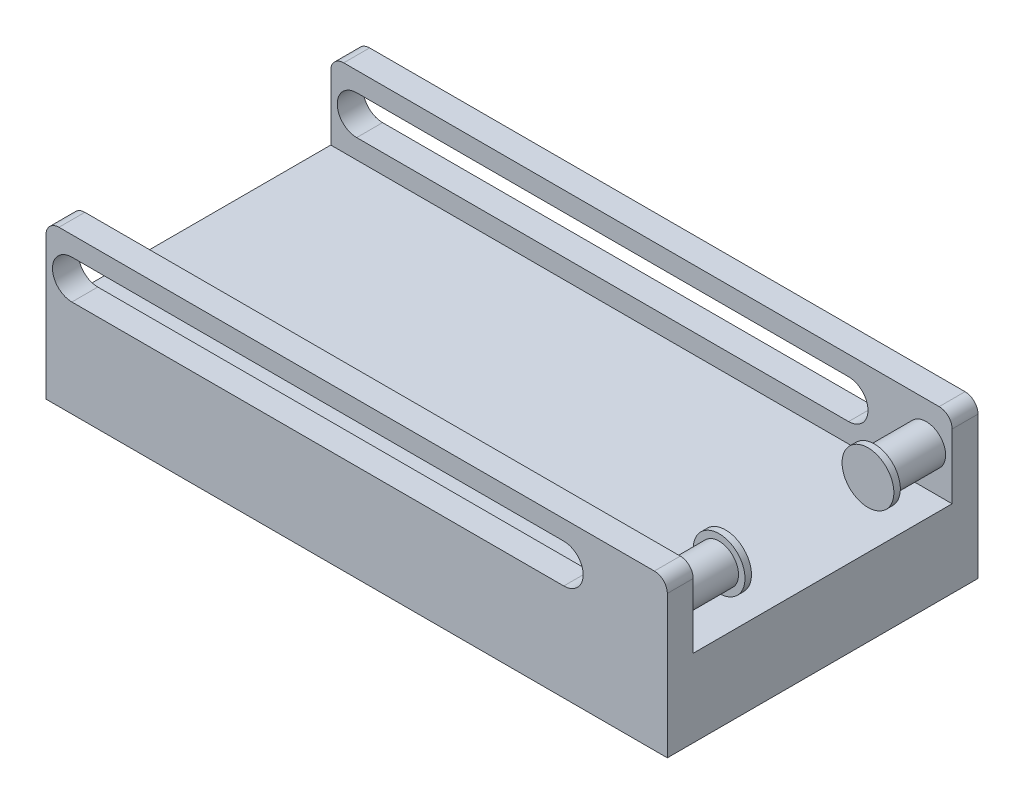
ISO-10303-21;
HEADER;
FILE_DESCRIPTION(('STEP AP214'),'2;1');
FILE_NAME('part.step','',(''),(''),'','','');
FILE_SCHEMA(('AUTOMOTIVE_DESIGN { 1 0 10303 214 1 1 1 1 }'));
ENDSEC;
DATA;
#1=APPLICATION_CONTEXT('core data for automotive mechanical design processes');
#2=APPLICATION_PROTOCOL_DEFINITION('international standard','automotive_design',2000,#1);
#3=PRODUCT_CONTEXT('',#1,'mechanical');
#4=PRODUCT('Part','Part','',(#3));
#5=PRODUCT_RELATED_PRODUCT_CATEGORY('part','',(#4));
#6=PRODUCT_DEFINITION_FORMATION('','',#4);
#7=PRODUCT_DEFINITION_CONTEXT('part definition',#1,'design');
#8=PRODUCT_DEFINITION('design','',#6,#7);
#9=PRODUCT_DEFINITION_SHAPE('','',#8);
#10=(LENGTH_UNIT() NAMED_UNIT(*) SI_UNIT(.MILLI.,.METRE.));
#11=(NAMED_UNIT(*) PLANE_ANGLE_UNIT() SI_UNIT($,.RADIAN.));
#12=(NAMED_UNIT(*) SI_UNIT($,.STERADIAN.) SOLID_ANGLE_UNIT());
#13=UNCERTAINTY_MEASURE_WITH_UNIT(LENGTH_MEASURE(1.E-05),#10,'distance_accuracy_value','');
#14=(GEOMETRIC_REPRESENTATION_CONTEXT(3) GLOBAL_UNCERTAINTY_ASSIGNED_CONTEXT((#13)) GLOBAL_UNIT_ASSIGNED_CONTEXT((#10,
#11,#12)) REPRESENTATION_CONTEXT('',''));
#15=CARTESIAN_POINT('',(0.,0.,0.));
#16=DIRECTION('',(0.,0.,1.));
#17=DIRECTION('',(1.,0.,0.));
#18=AXIS2_PLACEMENT_3D('',#15,#16,#17);
#19=CARTESIAN_POINT('',(0.,76.2,-304.8));
#20=DIRECTION('',(0.,0.,1.));
#21=DIRECTION('',(1.,0.,0.));
#22=AXIS2_PLACEMENT_3D('',#19,#20,#21);
#23=PLANE('',#22);
#24=DIRECTION('',(1.,0.,0.));
#25=VECTOR('',#24,1.);
#26=CARTESIAN_POINT('',(0.,152.4,-304.8));
#27=LINE('',#26,#25);
#28=CARTESIAN_POINT('',(12.7,152.4,-304.8));
#29=VERTEX_POINT('',#28);
#30=CARTESIAN_POINT('',(596.9,152.4,-304.8));
#31=VERTEX_POINT('',#30);
#32=EDGE_CURVE('E240',#29,#31,#27,.T.);
#33=ORIENTED_EDGE('',*,*,#32,.T.);
#34=CARTESIAN_POINT('',(596.9,139.7,-304.8));
#35=DIRECTION('',(0.,0.,1.));
#36=DIRECTION('',(1.,0.,0.));
#37=AXIS2_PLACEMENT_3D('',#34,#35,#36);
#38=CIRCLE('',#37,12.7);
#39=CARTESIAN_POINT('',(609.6,139.7,-304.8));
#40=VERTEX_POINT('',#39);
#41=EDGE_CURVE('E401',#31,#40,#38,.F.);
#42=ORIENTED_EDGE('',*,*,#41,.T.);
#43=DIRECTION('',(0.,-1.,0.));
#44=VECTOR('',#43,1.);
#45=CARTESIAN_POINT('',(609.6,76.2,-304.8));
#46=LINE('',#45,#44);
#47=CARTESIAN_POINT('',(609.6,0.,-304.8));
#48=VERTEX_POINT('',#47);
#49=EDGE_CURVE('E356',#40,#48,#46,.T.);
#50=ORIENTED_EDGE('',*,*,#49,.T.);
#51=DIRECTION('',(-1.,0.,0.));
#52=VECTOR('',#51,1.);
#53=CARTESIAN_POINT('',(0.,0.,-304.8));
#54=LINE('',#53,#52);
#55=CARTESIAN_POINT('',(0.,0.,-304.8));
#56=VERTEX_POINT('',#55);
#57=EDGE_CURVE('E335',#48,#56,#54,.T.);
#58=ORIENTED_EDGE('',*,*,#57,.T.);
#59=DIRECTION('',(0.,-1.,0.));
#60=VECTOR('',#59,1.);
#61=CARTESIAN_POINT('',(0.,76.2,-304.8));
#62=LINE('',#61,#60);
#63=CARTESIAN_POINT('',(0.,139.7,-304.8));
#64=VERTEX_POINT('',#63);
#65=EDGE_CURVE('E339',#64,#56,#62,.T.);
#66=ORIENTED_EDGE('',*,*,#65,.F.);
#67=CARTESIAN_POINT('',(12.7,139.7,-304.8));
#68=DIRECTION('',(0.,0.,1.));
#69=DIRECTION('',(1.,0.,0.));
#70=AXIS2_PLACEMENT_3D('',#67,#68,#69);
#71=CIRCLE('',#70,12.7);
#72=EDGE_CURVE('E398',#64,#29,#71,.F.);
#73=ORIENTED_EDGE('',*,*,#72,.T.);
#74=EDGE_LOOP('',(#33,#42,#50,#58,#66,#73));
#75=FACE_BOUND('',#74,.T.);
#76=CARTESIAN_POINT('',(508.,114.3,-304.8));
#77=DIRECTION('',(0.,0.,-1.));
#78=DIRECTION('',(-1.,0.,0.));
#79=AXIS2_PLACEMENT_3D('',#76,#77,#78);
#80=CIRCLE('',#79,19.05);
#81=CARTESIAN_POINT('',(508.,133.35,-304.8));
#82=VERTEX_POINT('',#81);
#83=CARTESIAN_POINT('',(508.,95.25,-304.8));
#84=VERTEX_POINT('',#83);
#85=EDGE_CURVE('E193',#82,#84,#80,.T.);
#86=ORIENTED_EDGE('',*,*,#85,.F.);
#87=DIRECTION('',(1.,0.,0.));
#88=VECTOR('',#87,1.);
#89=CARTESIAN_POINT('',(508.,133.35,-304.8));
#90=LINE('',#89,#88);
#91=CARTESIAN_POINT('',(25.4,133.35,-304.8));
#92=VERTEX_POINT('',#91);
#93=EDGE_CURVE('E180',#92,#82,#90,.T.);
#94=ORIENTED_EDGE('',*,*,#93,.F.);
#95=CARTESIAN_POINT('',(25.4,114.3,-304.8));
#96=DIRECTION('',(0.,0.,-1.));
#97=DIRECTION('',(-1.,0.,0.));
#98=AXIS2_PLACEMENT_3D('',#95,#96,#97);
#99=CIRCLE('',#98,19.05);
#100=CARTESIAN_POINT('',(25.4,95.25,-304.8));
#101=VERTEX_POINT('',#100);
#102=EDGE_CURVE('E192',#101,#92,#99,.T.);
#103=ORIENTED_EDGE('',*,*,#102,.F.);
#104=DIRECTION('',(-1.,0.,0.));
#105=VECTOR('',#104,1.);
#106=CARTESIAN_POINT('',(508.,95.25,-304.8));
#107=LINE('',#106,#105);
#108=EDGE_CURVE('E202',#84,#101,#107,.T.);
#109=ORIENTED_EDGE('',*,*,#108,.F.);
#110=EDGE_LOOP('',(#86,#94,#103,#109));
#111=FACE_BOUND('',#110,.T.);
#112=ADVANCED_FACE('F39',(#75,#111),#23,.F.);
#113=CARTESIAN_POINT('',(0.,152.4,-279.4));
#114=DIRECTION('',(0.,0.,1.));
#115=DIRECTION('',(1.,0.,0.));
#116=AXIS2_PLACEMENT_3D('',#113,#114,#115);
#117=PLANE('',#116);
#118=CARTESIAN_POINT('',(584.2,114.3,-279.4));
#119=DIRECTION('',(0.,0.,1.));
#120=DIRECTION('',(1.,0.,0.));
#121=AXIS2_PLACEMENT_3D('',#118,#119,#120);
#122=CIRCLE('',#121,19.05);
#123=CARTESIAN_POINT('',(603.25,114.3,-279.4));
#124=VERTEX_POINT('',#123);
#125=EDGE_CURVE('E757',#124,#124,#122,.T.);
#126=ORIENTED_EDGE('',*,*,#125,.F.);
#127=EDGE_LOOP('',(#126));
#128=FACE_BOUND('',#127,.T.);
#129=DIRECTION('',(0.,1.,0.));
#130=VECTOR('',#129,1.);
#131=CARTESIAN_POINT('',(609.6,152.4,-279.4));
#132=LINE('',#131,#130);
#133=CARTESIAN_POINT('',(609.6,76.2,-279.4));
#134=VERTEX_POINT('',#133);
#135=CARTESIAN_POINT('',(609.6,139.7,-279.4));
#136=VERTEX_POINT('',#135);
#137=EDGE_CURVE('E213',#134,#136,#132,.T.);
#138=ORIENTED_EDGE('',*,*,#137,.T.);
#139=CARTESIAN_POINT('',(596.9,139.7,-279.4));
#140=DIRECTION('',(0.,0.,1.));
#141=DIRECTION('',(1.,0.,0.));
#142=AXIS2_PLACEMENT_3D('',#139,#140,#141);
#143=CIRCLE('',#142,12.7);
#144=CARTESIAN_POINT('',(596.9,152.4,-279.4));
#145=VERTEX_POINT('',#144);
#146=EDGE_CURVE('E48',#136,#145,#143,.T.);
#147=ORIENTED_EDGE('',*,*,#146,.T.);
#148=DIRECTION('',(-1.,0.,0.));
#149=VECTOR('',#148,1.);
#150=CARTESIAN_POINT('',(0.,152.4,-279.4));
#151=LINE('',#150,#149);
#152=CARTESIAN_POINT('',(12.7,152.4,-279.4));
#153=VERTEX_POINT('',#152);
#154=EDGE_CURVE('E237',#145,#153,#151,.T.);
#155=ORIENTED_EDGE('',*,*,#154,.T.);
#156=CARTESIAN_POINT('',(12.7,139.7,-279.4));
#157=DIRECTION('',(0.,0.,1.));
#158=DIRECTION('',(1.,0.,0.));
#159=AXIS2_PLACEMENT_3D('',#156,#157,#158);
#160=CIRCLE('',#159,12.7);
#161=CARTESIAN_POINT('',(0.,139.7,-279.4));
#162=VERTEX_POINT('',#161);
#163=EDGE_CURVE('E55',#153,#162,#160,.T.);
#164=ORIENTED_EDGE('',*,*,#163,.T.);
#165=DIRECTION('',(0.,-1.,0.));
#166=VECTOR('',#165,1.);
#167=CARTESIAN_POINT('',(0.,152.4,-279.4));
#168=LINE('',#167,#166);
#169=CARTESIAN_POINT('',(0.,76.2,-279.4));
#170=VERTEX_POINT('',#169);
#171=EDGE_CURVE('E244',#162,#170,#168,.T.);
#172=ORIENTED_EDGE('',*,*,#171,.T.);
#173=DIRECTION('',(-1.,0.,0.));
#174=VECTOR('',#173,1.);
#175=CARTESIAN_POINT('',(0.,76.2,-279.4));
#176=LINE('',#175,#174);
#177=EDGE_CURVE('E231',#134,#170,#176,.T.);
#178=ORIENTED_EDGE('',*,*,#177,.F.);
#179=EDGE_LOOP('',(#138,#147,#155,#164,#172,#178));
#180=FACE_BOUND('',#179,.T.);
#181=DIRECTION('',(1.,0.,0.));
#182=VECTOR('',#181,1.);
#183=CARTESIAN_POINT('',(508.,133.35,-279.4));
#184=LINE('',#183,#182);
#185=CARTESIAN_POINT('',(25.4,133.35,-279.4));
#186=VERTEX_POINT('',#185);
#187=CARTESIAN_POINT('',(508.,133.35,-279.4));
#188=VERTEX_POINT('',#187);
#189=EDGE_CURVE('E222',#186,#188,#184,.T.);
#190=ORIENTED_EDGE('',*,*,#189,.T.);
#191=CARTESIAN_POINT('',(508.,114.3,-279.4));
#192=DIRECTION('',(0.,0.,-1.));
#193=DIRECTION('',(-1.,0.,0.));
#194=AXIS2_PLACEMENT_3D('',#191,#192,#193);
#195=CIRCLE('',#194,19.05);
#196=CARTESIAN_POINT('',(508.,95.25,-279.4));
#197=VERTEX_POINT('',#196);
#198=EDGE_CURVE('E200',#188,#197,#195,.T.);
#199=ORIENTED_EDGE('',*,*,#198,.T.);
#200=DIRECTION('',(-1.,0.,0.));
#201=VECTOR('',#200,1.);
#202=CARTESIAN_POINT('',(508.,95.25,-279.4));
#203=LINE('',#202,#201);
#204=CARTESIAN_POINT('',(25.4,95.25,-279.4));
#205=VERTEX_POINT('',#204);
#206=EDGE_CURVE('E206',#197,#205,#203,.T.);
#207=ORIENTED_EDGE('',*,*,#206,.T.);
#208=CARTESIAN_POINT('',(25.4,114.3,-279.4));
#209=DIRECTION('',(0.,0.,-1.));
#210=DIRECTION('',(-1.,0.,0.));
#211=AXIS2_PLACEMENT_3D('',#208,#209,#210);
#212=CIRCLE('',#211,19.05);
#213=EDGE_CURVE('E210',#205,#186,#212,.T.);
#214=ORIENTED_EDGE('',*,*,#213,.T.);
#215=EDGE_LOOP('',(#190,#199,#207,#214));
#216=FACE_BOUND('',#215,.T.);
#217=ADVANCED_FACE('F410',(#128,#180,#216),#117,.T.);
#218=CARTESIAN_POINT('',(0.,76.2,0.));
#219=DIRECTION('',(0.,-1.,0.));
#220=DIRECTION('',(0.,0.,-1.));
#221=AXIS2_PLACEMENT_3D('',#218,#219,#220);
#222=PLANE('',#221);
#223=DIRECTION('',(0.,0.,-1.));
#224=VECTOR('',#223,1.);
#225=CARTESIAN_POINT('',(609.6,76.2,0.));
#226=LINE('',#225,#224);
#227=CARTESIAN_POINT('',(609.6,76.2,-25.4));
#228=VERTEX_POINT('',#227);
#229=EDGE_CURVE('E334',#228,#134,#226,.T.);
#230=ORIENTED_EDGE('',*,*,#229,.T.);
#231=ORIENTED_EDGE('',*,*,#177,.T.);
#232=DIRECTION('',(0.,0.,1.));
#233=VECTOR('',#232,1.);
#234=CARTESIAN_POINT('',(0.,76.2,0.));
#235=LINE('',#234,#233);
#236=CARTESIAN_POINT('',(0.,76.2,-25.4));
#237=VERTEX_POINT('',#236);
#238=EDGE_CURVE('E331',#170,#237,#235,.T.);
#239=ORIENTED_EDGE('',*,*,#238,.T.);
#240=DIRECTION('',(-1.,0.,0.));
#241=VECTOR('',#240,1.);
#242=CARTESIAN_POINT('',(0.,76.2,-25.4));
#243=LINE('',#242,#241);
#244=EDGE_CURVE('E305',#228,#237,#243,.T.);
#245=ORIENTED_EDGE('',*,*,#244,.F.);
#246=EDGE_LOOP('',(#230,#231,#239,#245));
#247=FACE_BOUND('',#246,.T.);
#248=ADVANCED_FACE('F445',(#247),#222,.F.);
#249=CARTESIAN_POINT('',(0.,76.2,0.));
#250=DIRECTION('',(1.,0.,0.));
#251=DIRECTION('',(0.,0.,-1.));
#252=AXIS2_PLACEMENT_3D('',#249,#250,#251);
#253=PLANE('',#252);
#254=ORIENTED_EDGE('',*,*,#171,.F.);
#255=DIRECTION('',(0.,0.,-1.));
#256=VECTOR('',#255,1.);
#257=CARTESIAN_POINT('',(0.,139.7,0.));
#258=LINE('',#257,#256);
#259=EDGE_CURVE('E11',#162,#64,#258,.T.);
#260=ORIENTED_EDGE('',*,*,#259,.T.);
#261=ORIENTED_EDGE('',*,*,#65,.T.);
#262=DIRECTION('',(0.,0.,1.));
#263=VECTOR('',#262,1.);
#264=CARTESIAN_POINT('',(0.,0.,0.));
#265=LINE('',#264,#263);
#266=CARTESIAN_POINT('',(0.,0.,0.));
#267=VERTEX_POINT('',#266);
#268=EDGE_CURVE('E330',#56,#267,#265,.T.);
#269=ORIENTED_EDGE('',*,*,#268,.T.);
#270=DIRECTION('',(0.,-1.,0.));
#271=VECTOR('',#270,1.);
#272=CARTESIAN_POINT('',(0.,76.2,0.));
#273=LINE('',#272,#271);
#274=CARTESIAN_POINT('',(0.,139.7,0.));
#275=VERTEX_POINT('',#274);
#276=EDGE_CURVE('E362',#275,#267,#273,.T.);
#277=ORIENTED_EDGE('',*,*,#276,.F.);
#278=DIRECTION('',(0.,0.,1.));
#279=VECTOR('',#278,1.);
#280=CARTESIAN_POINT('',(0.,139.7,0.));
#281=LINE('',#280,#279);
#282=CARTESIAN_POINT('',(0.,139.7,-25.4));
#283=VERTEX_POINT('',#282);
#284=EDGE_CURVE('E388',#275,#283,#281,.F.);
#285=ORIENTED_EDGE('',*,*,#284,.T.);
#286=DIRECTION('',(0.,-1.,0.));
#287=VECTOR('',#286,1.);
#288=CARTESIAN_POINT('',(0.,152.4,-25.4));
#289=LINE('',#288,#287);
#290=EDGE_CURVE('E323',#283,#237,#289,.T.);
#291=ORIENTED_EDGE('',*,*,#290,.T.);
#292=ORIENTED_EDGE('',*,*,#238,.F.);
#293=EDGE_LOOP('',(#254,#260,#261,#269,#277,#285,#291,#292));
#294=FACE_BOUND('',#293,.T.);
#295=ADVANCED_FACE('F430',(#294),#253,.F.);
#296=CARTESIAN_POINT('',(0.,76.2,0.));
#297=DIRECTION('',(0.,0.,-1.));
#298=DIRECTION('',(-1.,0.,0.));
#299=AXIS2_PLACEMENT_3D('',#296,#297,#298);
#300=PLANE('',#299);
#301=DIRECTION('',(0.,-1.,0.));
#302=VECTOR('',#301,1.);
#303=CARTESIAN_POINT('',(609.6,76.2,0.));
#304=LINE('',#303,#302);
#305=CARTESIAN_POINT('',(609.6,139.7,0.));
#306=VERTEX_POINT('',#305);
#307=CARTESIAN_POINT('',(609.6,0.,0.));
#308=VERTEX_POINT('',#307);
#309=EDGE_CURVE('E359',#306,#308,#304,.T.);
#310=ORIENTED_EDGE('',*,*,#309,.F.);
#311=CARTESIAN_POINT('',(596.9,139.7,0.));
#312=DIRECTION('',(0.,0.,-1.));
#313=DIRECTION('',(-1.,0.,0.));
#314=AXIS2_PLACEMENT_3D('',#311,#312,#313);
#315=CIRCLE('',#314,12.7);
#316=CARTESIAN_POINT('',(596.9,152.4,0.));
#317=VERTEX_POINT('',#316);
#318=EDGE_CURVE('E372',#306,#317,#315,.F.);
#319=ORIENTED_EDGE('',*,*,#318,.T.);
#320=DIRECTION('',(1.,0.,0.));
#321=VECTOR('',#320,1.);
#322=CARTESIAN_POINT('',(0.,152.4,0.));
#323=LINE('',#322,#321);
#324=CARTESIAN_POINT('',(12.7,152.4,0.));
#325=VERTEX_POINT('',#324);
#326=EDGE_CURVE('E315',#325,#317,#323,.T.);
#327=ORIENTED_EDGE('',*,*,#326,.F.);
#328=CARTESIAN_POINT('',(12.7,139.7,0.));
#329=DIRECTION('',(0.,0.,-1.));
#330=DIRECTION('',(-1.,0.,0.));
#331=AXIS2_PLACEMENT_3D('',#328,#329,#330);
#332=CIRCLE('',#331,12.7);
#333=EDGE_CURVE('E369',#325,#275,#332,.F.);
#334=ORIENTED_EDGE('',*,*,#333,.T.);
#335=ORIENTED_EDGE('',*,*,#276,.T.);
#336=DIRECTION('',(1.,0.,0.));
#337=VECTOR('',#336,1.);
#338=CARTESIAN_POINT('',(0.,0.,0.));
#339=LINE('',#338,#337);
#340=EDGE_CURVE('E343',#267,#308,#339,.T.);
#341=ORIENTED_EDGE('',*,*,#340,.T.);
#342=EDGE_LOOP('',(#310,#319,#327,#334,#335,#341));
#343=FACE_BOUND('',#342,.T.);
#344=DIRECTION('',(1.,0.,0.));
#345=VECTOR('',#344,1.);
#346=CARTESIAN_POINT('',(508.,133.35,0.));
#347=LINE('',#346,#345);
#348=CARTESIAN_POINT('',(25.4,133.35,0.));
#349=VERTEX_POINT('',#348);
#350=CARTESIAN_POINT('',(508.,133.35,0.));
#351=VERTEX_POINT('',#350);
#352=EDGE_CURVE('E284',#349,#351,#347,.T.);
#353=ORIENTED_EDGE('',*,*,#352,.T.);
#354=CARTESIAN_POINT('',(508.,114.3,0.));
#355=DIRECTION('',(0.,0.,-1.));
#356=DIRECTION('',(-1.,0.,0.));
#357=AXIS2_PLACEMENT_3D('',#354,#355,#356);
#358=CIRCLE('',#357,19.05);
#359=CARTESIAN_POINT('',(508.,95.25,0.));
#360=VERTEX_POINT('',#359);
#361=EDGE_CURVE('E271',#351,#360,#358,.T.);
#362=ORIENTED_EDGE('',*,*,#361,.T.);
#363=DIRECTION('',(-1.,0.,0.));
#364=VECTOR('',#363,1.);
#365=CARTESIAN_POINT('',(508.,95.25,0.));
#366=LINE('',#365,#364);
#367=CARTESIAN_POINT('',(25.4,95.25,0.));
#368=VERTEX_POINT('',#367);
#369=EDGE_CURVE('E275',#360,#368,#366,.T.);
#370=ORIENTED_EDGE('',*,*,#369,.T.);
#371=CARTESIAN_POINT('',(25.4,114.3,0.));
#372=DIRECTION('',(0.,0.,-1.));
#373=DIRECTION('',(-1.,0.,0.));
#374=AXIS2_PLACEMENT_3D('',#371,#372,#373);
#375=CIRCLE('',#374,19.05);
#376=EDGE_CURVE('E280',#368,#349,#375,.T.);
#377=ORIENTED_EDGE('',*,*,#376,.T.);
#378=EDGE_LOOP('',(#353,#362,#370,#377));
#379=FACE_BOUND('',#378,.T.);
#380=ADVANCED_FACE('F453',(#343,#379),#300,.F.);
#381=CARTESIAN_POINT('',(609.6,76.2,0.));
#382=DIRECTION('',(-1.,0.,0.));
#383=DIRECTION('',(0.,0.,1.));
#384=AXIS2_PLACEMENT_3D('',#381,#382,#383);
#385=PLANE('',#384);
#386=ORIENTED_EDGE('',*,*,#49,.F.);
#387=DIRECTION('',(0.,0.,-1.));
#388=VECTOR('',#387,1.);
#389=CARTESIAN_POINT('',(609.6,139.7,0.));
#390=LINE('',#389,#388);
#391=EDGE_CURVE('E63',#40,#136,#390,.F.);
#392=ORIENTED_EDGE('',*,*,#391,.T.);
#393=ORIENTED_EDGE('',*,*,#137,.F.);
#394=ORIENTED_EDGE('',*,*,#229,.F.);
#395=DIRECTION('',(0.,1.,0.));
#396=VECTOR('',#395,1.);
#397=CARTESIAN_POINT('',(609.6,152.4,-25.4));
#398=LINE('',#397,#396);
#399=CARTESIAN_POINT('',(609.6,139.7,-25.4));
#400=VERTEX_POINT('',#399);
#401=EDGE_CURVE('E266',#228,#400,#398,.T.);
#402=ORIENTED_EDGE('',*,*,#401,.T.);
#403=DIRECTION('',(0.,0.,1.));
#404=VECTOR('',#403,1.);
#405=CARTESIAN_POINT('',(609.6,139.7,0.));
#406=LINE('',#405,#404);
#407=EDGE_CURVE('E365',#400,#306,#406,.T.);
#408=ORIENTED_EDGE('',*,*,#407,.T.);
#409=ORIENTED_EDGE('',*,*,#309,.T.);
#410=DIRECTION('',(0.,0.,-1.));
#411=VECTOR('',#410,1.);
#412=CARTESIAN_POINT('',(609.6,0.,0.));
#413=LINE('',#412,#411);
#414=EDGE_CURVE('E347',#308,#48,#413,.T.);
#415=ORIENTED_EDGE('',*,*,#414,.T.);
#416=EDGE_LOOP('',(#386,#392,#393,#394,#402,#408,#409,#415));
#417=FACE_BOUND('',#416,.T.);
#418=ADVANCED_FACE('F420',(#417),#385,.F.);
#419=CARTESIAN_POINT('',(0.,0.,0.));
#420=DIRECTION('',(0.,-1.,0.));
#421=DIRECTION('',(0.,0.,-1.));
#422=AXIS2_PLACEMENT_3D('',#419,#420,#421);
#423=PLANE('',#422);
#424=ORIENTED_EDGE('',*,*,#268,.F.);
#425=ORIENTED_EDGE('',*,*,#57,.F.);
#426=ORIENTED_EDGE('',*,*,#414,.F.);
#427=ORIENTED_EDGE('',*,*,#340,.F.);
#428=EDGE_LOOP('',(#424,#425,#426,#427));
#429=FACE_BOUND('',#428,.T.);
#430=ADVANCED_FACE('F427',(#429),#423,.T.);
#431=CARTESIAN_POINT('',(0.,152.4,-25.4));
#432=DIRECTION('',(0.,0.,1.));
#433=DIRECTION('',(1.,0.,0.));
#434=AXIS2_PLACEMENT_3D('',#431,#432,#433);
#435=PLANE('',#434);
#436=CARTESIAN_POINT('',(584.2,114.3,-25.4));
#437=DIRECTION('',(0.,0.,1.));
#438=DIRECTION('',(1.,0.,0.));
#439=AXIS2_PLACEMENT_3D('',#436,#437,#438);
#440=CIRCLE('',#439,19.05);
#441=CARTESIAN_POINT('',(603.25,114.3,-25.4));
#442=VERTEX_POINT('',#441);
#443=EDGE_CURVE('E262',#442,#442,#440,.T.);
#444=ORIENTED_EDGE('',*,*,#443,.T.);
#445=EDGE_LOOP('',(#444));
#446=FACE_BOUND('',#445,.T.);
#447=DIRECTION('',(-1.,0.,0.));
#448=VECTOR('',#447,1.);
#449=CARTESIAN_POINT('',(508.,95.25,-25.4));
#450=LINE('',#449,#448);
#451=CARTESIAN_POINT('',(508.,95.25,-25.4));
#452=VERTEX_POINT('',#451);
#453=CARTESIAN_POINT('',(25.4,95.25,-25.4));
#454=VERTEX_POINT('',#453);
#455=EDGE_CURVE('E291',#452,#454,#450,.T.);
#456=ORIENTED_EDGE('',*,*,#455,.F.);
#457=CARTESIAN_POINT('',(508.,114.3,-25.4));
#458=DIRECTION('',(0.,0.,-1.));
#459=DIRECTION('',(-1.,0.,0.));
#460=AXIS2_PLACEMENT_3D('',#457,#458,#459);
#461=CIRCLE('',#460,19.05);
#462=CARTESIAN_POINT('',(508.,133.35,-25.4));
#463=VERTEX_POINT('',#462);
#464=EDGE_CURVE('E270',#463,#452,#461,.T.);
#465=ORIENTED_EDGE('',*,*,#464,.F.);
#466=DIRECTION('',(1.,0.,0.));
#467=VECTOR('',#466,1.);
#468=CARTESIAN_POINT('',(508.,133.35,-25.4));
#469=LINE('',#468,#467);
#470=CARTESIAN_POINT('',(25.4,133.35,-25.4));
#471=VERTEX_POINT('',#470);
#472=EDGE_CURVE('E276',#471,#463,#469,.T.);
#473=ORIENTED_EDGE('',*,*,#472,.F.);
#474=CARTESIAN_POINT('',(25.4,114.3,-25.4));
#475=DIRECTION('',(0.,0.,-1.));
#476=DIRECTION('',(-1.,0.,0.));
#477=AXIS2_PLACEMENT_3D('',#474,#475,#476);
#478=CIRCLE('',#477,19.05);
#479=EDGE_CURVE('E295',#454,#471,#478,.T.);
#480=ORIENTED_EDGE('',*,*,#479,.F.);
#481=EDGE_LOOP('',(#456,#465,#473,#480));
#482=FACE_BOUND('',#481,.T.);
#483=DIRECTION('',(-1.,0.,0.));
#484=VECTOR('',#483,1.);
#485=CARTESIAN_POINT('',(0.,152.4,-25.4));
#486=LINE('',#485,#484);
#487=CARTESIAN_POINT('',(596.9,152.4,-25.4));
#488=VERTEX_POINT('',#487);
#489=CARTESIAN_POINT('',(12.7,152.4,-25.4));
#490=VERTEX_POINT('',#489);
#491=EDGE_CURVE('E319',#488,#490,#486,.T.);
#492=ORIENTED_EDGE('',*,*,#491,.F.);
#493=CARTESIAN_POINT('',(596.9,139.7,-25.4));
#494=DIRECTION('',(0.,0.,1.));
#495=DIRECTION('',(1.,0.,0.));
#496=AXIS2_PLACEMENT_3D('',#493,#494,#495);
#497=CIRCLE('',#496,12.7);
#498=EDGE_CURVE('E385',#488,#400,#497,.F.);
#499=ORIENTED_EDGE('',*,*,#498,.T.);
#500=ORIENTED_EDGE('',*,*,#401,.F.);
#501=ORIENTED_EDGE('',*,*,#244,.T.);
#502=ORIENTED_EDGE('',*,*,#290,.F.);
#503=CARTESIAN_POINT('',(12.7,139.7,-25.4));
#504=DIRECTION('',(0.,0.,1.));
#505=DIRECTION('',(1.,0.,0.));
#506=AXIS2_PLACEMENT_3D('',#503,#504,#505);
#507=CIRCLE('',#506,12.7);
#508=EDGE_CURVE('E382',#283,#490,#507,.F.);
#509=ORIENTED_EDGE('',*,*,#508,.T.);
#510=EDGE_LOOP('',(#492,#499,#500,#501,#502,#509));
#511=FACE_BOUND('',#510,.T.);
#512=ADVANCED_FACE('F477',(#446,#482,#511),#435,.F.);
#513=CARTESIAN_POINT('',(0.,152.4,0.));
#514=DIRECTION('',(0.,-1.,0.));
#515=DIRECTION('',(0.,0.,-1.));
#516=AXIS2_PLACEMENT_3D('',#513,#514,#515);
#517=PLANE('',#516);
#518=ORIENTED_EDGE('',*,*,#326,.T.);
#519=DIRECTION('',(0.,0.,1.));
#520=VECTOR('',#519,1.);
#521=CARTESIAN_POINT('',(596.9,152.4,0.));
#522=LINE('',#521,#520);
#523=EDGE_CURVE('E379',#317,#488,#522,.F.);
#524=ORIENTED_EDGE('',*,*,#523,.T.);
#525=ORIENTED_EDGE('',*,*,#491,.T.);
#526=DIRECTION('',(0.,0.,1.));
#527=VECTOR('',#526,1.);
#528=CARTESIAN_POINT('',(12.7,152.4,0.));
#529=LINE('',#528,#527);
#530=EDGE_CURVE('E375',#490,#325,#529,.T.);
#531=ORIENTED_EDGE('',*,*,#530,.T.);
#532=EDGE_LOOP('',(#518,#524,#525,#531));
#533=FACE_BOUND('',#532,.T.);
#534=ADVANCED_FACE('F480',(#533),#517,.F.);
#535=CARTESIAN_POINT('',(508.,114.3,0.));
#536=DIRECTION('',(0.,0.,-1.));
#537=DIRECTION('',(-1.,0.,0.));
#538=AXIS2_PLACEMENT_3D('',#535,#536,#537);
#539=CYLINDRICAL_SURFACE('',#538,19.05);
#540=ORIENTED_EDGE('',*,*,#464,.T.);
#541=DIRECTION('',(0.,0.,-1.));
#542=VECTOR('',#541,1.);
#543=CARTESIAN_POINT('',(508.,95.25,0.));
#544=LINE('',#543,#542);
#545=EDGE_CURVE('E288',#360,#452,#544,.T.);
#546=ORIENTED_EDGE('',*,*,#545,.F.);
#547=ORIENTED_EDGE('',*,*,#361,.F.);
#548=DIRECTION('',(0.,0.,-1.));
#549=VECTOR('',#548,1.);
#550=CARTESIAN_POINT('',(508.,133.35,0.));
#551=LINE('',#550,#549);
#552=EDGE_CURVE('E302',#351,#463,#551,.T.);
#553=ORIENTED_EDGE('',*,*,#552,.T.);
#554=EDGE_LOOP('',(#540,#546,#547,#553));
#555=FACE_BOUND('',#554,.T.);
#556=ADVANCED_FACE('F495',(#555),#539,.F.);
#557=CARTESIAN_POINT('',(508.,133.35,0.));
#558=DIRECTION('',(0.,1.,0.));
#559=DIRECTION('',(0.,0.,1.));
#560=AXIS2_PLACEMENT_3D('',#557,#558,#559);
#561=PLANE('',#560);
#562=ORIENTED_EDGE('',*,*,#472,.T.);
#563=ORIENTED_EDGE('',*,*,#552,.F.);
#564=ORIENTED_EDGE('',*,*,#352,.F.);
#565=DIRECTION('',(0.,0.,-1.));
#566=VECTOR('',#565,1.);
#567=CARTESIAN_POINT('',(25.4,133.35,0.));
#568=LINE('',#567,#566);
#569=EDGE_CURVE('E306',#349,#471,#568,.T.);
#570=ORIENTED_EDGE('',*,*,#569,.T.);
#571=EDGE_LOOP('',(#562,#563,#564,#570));
#572=FACE_BOUND('',#571,.T.);
#573=ADVANCED_FACE('F491',(#572),#561,.F.);
#574=CARTESIAN_POINT('',(25.4,114.3,0.));
#575=DIRECTION('',(0.,0.,-1.));
#576=DIRECTION('',(-1.,0.,0.));
#577=AXIS2_PLACEMENT_3D('',#574,#575,#576);
#578=CYLINDRICAL_SURFACE('',#577,19.05);
#579=ORIENTED_EDGE('',*,*,#479,.T.);
#580=ORIENTED_EDGE('',*,*,#569,.F.);
#581=ORIENTED_EDGE('',*,*,#376,.F.);
#582=DIRECTION('',(0.,0.,-1.));
#583=VECTOR('',#582,1.);
#584=CARTESIAN_POINT('',(25.4,95.25,0.));
#585=LINE('',#584,#583);
#586=EDGE_CURVE('E309',#368,#454,#585,.T.);
#587=ORIENTED_EDGE('',*,*,#586,.T.);
#588=EDGE_LOOP('',(#579,#580,#581,#587));
#589=FACE_BOUND('',#588,.T.);
#590=ADVANCED_FACE('F503',(#589),#578,.F.);
#591=CARTESIAN_POINT('',(508.,95.25,0.));
#592=DIRECTION('',(0.,-1.,0.));
#593=DIRECTION('',(0.,0.,-1.));
#594=AXIS2_PLACEMENT_3D('',#591,#592,#593);
#595=PLANE('',#594);
#596=ORIENTED_EDGE('',*,*,#455,.T.);
#597=ORIENTED_EDGE('',*,*,#586,.F.);
#598=ORIENTED_EDGE('',*,*,#369,.F.);
#599=ORIENTED_EDGE('',*,*,#545,.T.);
#600=EDGE_LOOP('',(#596,#597,#598,#599));
#601=FACE_BOUND('',#600,.T.);
#602=ADVANCED_FACE('F500',(#601),#595,.F.);
#603=CARTESIAN_POINT('',(584.2,114.3,-76.2));
#604=DIRECTION('',(0.,0.,1.));
#605=DIRECTION('',(1.,0.,0.));
#606=AXIS2_PLACEMENT_3D('',#603,#604,#605);
#607=CYLINDRICAL_SURFACE('',#606,19.05);
#608=CARTESIAN_POINT('',(584.2,114.3,-76.2));
#609=DIRECTION('',(0.,0.,1.));
#610=DIRECTION('',(1.,0.,0.));
#611=AXIS2_PLACEMENT_3D('',#608,#609,#610);
#612=CIRCLE('',#611,19.05);
#613=CARTESIAN_POINT('',(603.25,114.3,-76.2));
#614=VERTEX_POINT('',#613);
#615=EDGE_CURVE('E255',#614,#614,#612,.T.);
#616=ORIENTED_EDGE('',*,*,#615,.T.);
#617=EDGE_LOOP('',(#616));
#618=FACE_BOUND('',#617,.T.);
#619=ORIENTED_EDGE('',*,*,#443,.F.);
#620=EDGE_LOOP('',(#619));
#621=FACE_BOUND('',#620,.T.);
#622=ADVANCED_FACE('F572',(#618,#621),#607,.T.);
#623=CARTESIAN_POINT('',(584.2,114.3,-82.55));
#624=DIRECTION('',(0.,0.,1.));
#625=DIRECTION('',(1.,0.,0.));
#626=AXIS2_PLACEMENT_3D('',#623,#624,#625);
#627=CYLINDRICAL_SURFACE('',#626,25.4);
#628=CARTESIAN_POINT('',(584.2,114.3,-82.55));
#629=DIRECTION('',(0.,0.,-1.));
#630=DIRECTION('',(-1.,0.,0.));
#631=AXIS2_PLACEMENT_3D('',#628,#629,#630);
#632=CIRCLE('',#631,25.4);
#633=CARTESIAN_POINT('',(558.8,114.3,-82.55));
#634=VERTEX_POINT('',#633);
#635=EDGE_CURVE('E251',#634,#634,#632,.T.);
#636=ORIENTED_EDGE('',*,*,#635,.F.);
#637=EDGE_LOOP('',(#636));
#638=FACE_BOUND('',#637,.T.);
#639=CARTESIAN_POINT('',(584.2,114.3,-76.2));
#640=DIRECTION('',(0.,0.,-1.));
#641=DIRECTION('',(-1.,0.,0.));
#642=AXIS2_PLACEMENT_3D('',#639,#640,#641);
#643=CIRCLE('',#642,25.4);
#644=CARTESIAN_POINT('',(558.8,114.3,-76.2));
#645=VERTEX_POINT('',#644);
#646=EDGE_CURVE('E250',#645,#645,#643,.T.);
#647=ORIENTED_EDGE('',*,*,#646,.T.);
#648=EDGE_LOOP('',(#647));
#649=FACE_BOUND('',#648,.T.);
#650=ADVANCED_FACE('F581',(#638,#649),#627,.T.);
#651=CARTESIAN_POINT('',(584.2,114.3,-82.55));
#652=DIRECTION('',(0.,0.,-1.));
#653=DIRECTION('',(-1.,0.,0.));
#654=AXIS2_PLACEMENT_3D('',#651,#652,#653);
#655=PLANE('',#654);
#656=ORIENTED_EDGE('',*,*,#635,.T.);
#657=EDGE_LOOP('',(#656));
#658=FACE_BOUND('',#657,.T.);
#659=ADVANCED_FACE('F592',(#658),#655,.T.);
#660=CARTESIAN_POINT('',(584.2,114.3,-76.2));
#661=DIRECTION('',(0.,0.,-1.));
#662=DIRECTION('',(-1.,0.,0.));
#663=AXIS2_PLACEMENT_3D('',#660,#661,#662);
#664=PLANE('',#663);
#665=ORIENTED_EDGE('',*,*,#615,.F.);
#666=EDGE_LOOP('',(#665));
#667=FACE_BOUND('',#666,.T.);
#668=ORIENTED_EDGE('',*,*,#646,.F.);
#669=EDGE_LOOP('',(#668));
#670=FACE_BOUND('',#669,.T.);
#671=ADVANCED_FACE('F463',(#667,#670),#664,.F.);
#672=CARTESIAN_POINT('',(596.9,139.7,0.));
#673=DIRECTION('',(0.,0.,1.));
#674=DIRECTION('',(1.,0.,0.));
#675=AXIS2_PLACEMENT_3D('',#672,#673,#674);
#676=CYLINDRICAL_SURFACE('',#675,12.7);
#677=ORIENTED_EDGE('',*,*,#498,.F.);
#678=ORIENTED_EDGE('',*,*,#523,.F.);
#679=ORIENTED_EDGE('',*,*,#318,.F.);
#680=ORIENTED_EDGE('',*,*,#407,.F.);
#681=EDGE_LOOP('',(#677,#678,#679,#680));
#682=FACE_BOUND('',#681,.T.);
#683=ADVANCED_FACE('F459',(#682),#676,.T.);
#684=CARTESIAN_POINT('',(12.7,139.7,0.));
#685=DIRECTION('',(0.,0.,1.));
#686=DIRECTION('',(1.,0.,0.));
#687=AXIS2_PLACEMENT_3D('',#684,#685,#686);
#688=CYLINDRICAL_SURFACE('',#687,12.7);
#689=ORIENTED_EDGE('',*,*,#508,.F.);
#690=ORIENTED_EDGE('',*,*,#284,.F.);
#691=ORIENTED_EDGE('',*,*,#333,.F.);
#692=ORIENTED_EDGE('',*,*,#530,.F.);
#693=EDGE_LOOP('',(#689,#690,#691,#692));
#694=FACE_BOUND('',#693,.T.);
#695=ADVANCED_FACE('F462',(#694),#688,.T.);
#696=CARTESIAN_POINT('',(0.,152.4,-304.8));
#697=DIRECTION('',(0.,-1.,0.));
#698=DIRECTION('',(0.,0.,1.));
#699=AXIS2_PLACEMENT_3D('',#696,#697,#698);
#700=PLANE('',#699);
#701=ORIENTED_EDGE('',*,*,#154,.F.);
#702=DIRECTION('',(0.,0.,-1.));
#703=VECTOR('',#702,1.);
#704=CARTESIAN_POINT('',(596.9,152.4,-304.8));
#705=LINE('',#704,#703);
#706=EDGE_CURVE('E394',#145,#31,#705,.T.);
#707=ORIENTED_EDGE('',*,*,#706,.T.);
#708=ORIENTED_EDGE('',*,*,#32,.F.);
#709=DIRECTION('',(0.,0.,-1.));
#710=VECTOR('',#709,1.);
#711=CARTESIAN_POINT('',(12.7,152.4,-304.8));
#712=LINE('',#711,#710);
#713=EDGE_CURVE('E391',#29,#153,#712,.F.);
#714=ORIENTED_EDGE('',*,*,#713,.T.);
#715=EDGE_LOOP('',(#701,#707,#708,#714));
#716=FACE_BOUND('',#715,.T.);
#717=ADVANCED_FACE('F415',(#716),#700,.F.);
#718=CARTESIAN_POINT('',(508.,114.3,-304.8));
#719=DIRECTION('',(0.,0.,1.));
#720=DIRECTION('',(1.,0.,0.));
#721=AXIS2_PLACEMENT_3D('',#718,#719,#720);
#722=CYLINDRICAL_SURFACE('',#721,19.05);
#723=ORIENTED_EDGE('',*,*,#198,.F.);
#724=DIRECTION('',(0.,0.,1.));
#725=VECTOR('',#724,1.);
#726=CARTESIAN_POINT('',(508.,133.35,-304.8));
#727=LINE('',#726,#725);
#728=EDGE_CURVE('E184',#82,#188,#727,.T.);
#729=ORIENTED_EDGE('',*,*,#728,.F.);
#730=ORIENTED_EDGE('',*,*,#85,.T.);
#731=DIRECTION('',(0.,0.,1.));
#732=VECTOR('',#731,1.);
#733=CARTESIAN_POINT('',(508.,95.25,-304.8));
#734=LINE('',#733,#732);
#735=EDGE_CURVE('E228',#84,#197,#734,.T.);
#736=ORIENTED_EDGE('',*,*,#735,.T.);
#737=EDGE_LOOP('',(#723,#729,#730,#736));
#738=FACE_BOUND('',#737,.T.);
#739=ADVANCED_FACE('F196',(#738),#722,.F.);
#740=CARTESIAN_POINT('',(508.,95.25,-304.8));
#741=DIRECTION('',(0.,1.,0.));
#742=DIRECTION('',(0.,0.,1.));
#743=AXIS2_PLACEMENT_3D('',#740,#741,#742);
#744=PLANE('',#743);
#745=ORIENTED_EDGE('',*,*,#206,.F.);
#746=ORIENTED_EDGE('',*,*,#735,.F.);
#747=ORIENTED_EDGE('',*,*,#108,.T.);
#748=DIRECTION('',(0.,0.,1.));
#749=VECTOR('',#748,1.);
#750=CARTESIAN_POINT('',(25.4,95.25,-304.8));
#751=LINE('',#750,#749);
#752=EDGE_CURVE('E232',#101,#205,#751,.T.);
#753=ORIENTED_EDGE('',*,*,#752,.T.);
#754=EDGE_LOOP('',(#745,#746,#747,#753));
#755=FACE_BOUND('',#754,.T.);
#756=ADVANCED_FACE('F713',(#755),#744,.T.);
#757=CARTESIAN_POINT('',(25.4,114.3,-304.8));
#758=DIRECTION('',(0.,0.,1.));
#759=DIRECTION('',(1.,0.,0.));
#760=AXIS2_PLACEMENT_3D('',#757,#758,#759);
#761=CYLINDRICAL_SURFACE('',#760,19.05);
#762=ORIENTED_EDGE('',*,*,#213,.F.);
#763=ORIENTED_EDGE('',*,*,#752,.F.);
#764=ORIENTED_EDGE('',*,*,#102,.T.);
#765=DIRECTION('',(0.,0.,1.));
#766=VECTOR('',#765,1.);
#767=CARTESIAN_POINT('',(25.4,133.35,-304.8));
#768=LINE('',#767,#766);
#769=EDGE_CURVE('E186',#92,#186,#768,.T.);
#770=ORIENTED_EDGE('',*,*,#769,.T.);
#771=EDGE_LOOP('',(#762,#763,#764,#770));
#772=FACE_BOUND('',#771,.T.);
#773=ADVANCED_FACE('F707',(#772),#761,.F.);
#774=CARTESIAN_POINT('',(508.,133.35,-304.8));
#775=DIRECTION('',(0.,-1.,0.));
#776=DIRECTION('',(0.,0.,-1.));
#777=AXIS2_PLACEMENT_3D('',#774,#775,#776);
#778=PLANE('',#777);
#779=ORIENTED_EDGE('',*,*,#189,.F.);
#780=ORIENTED_EDGE('',*,*,#769,.F.);
#781=ORIENTED_EDGE('',*,*,#93,.T.);
#782=ORIENTED_EDGE('',*,*,#728,.T.);
#783=EDGE_LOOP('',(#779,#780,#781,#782));
#784=FACE_BOUND('',#783,.T.);
#785=ADVANCED_FACE('F183',(#784),#778,.T.);
#786=CARTESIAN_POINT('',(584.2,114.3,-228.6));
#787=DIRECTION('',(0.,0.,-1.));
#788=DIRECTION('',(-1.,0.,0.));
#789=AXIS2_PLACEMENT_3D('',#786,#787,#788);
#790=CYLINDRICAL_SURFACE('',#789,19.05);
#791=CARTESIAN_POINT('',(584.2,114.3,-228.6));
#792=DIRECTION('',(0.,0.,1.));
#793=DIRECTION('',(1.,0.,0.));
#794=AXIS2_PLACEMENT_3D('',#791,#792,#793);
#795=CIRCLE('',#794,19.05);
#796=CARTESIAN_POINT('',(603.25,114.3,-228.6));
#797=VERTEX_POINT('',#796);
#798=EDGE_CURVE('E747',#797,#797,#795,.T.);
#799=ORIENTED_EDGE('',*,*,#798,.F.);
#800=EDGE_LOOP('',(#799));
#801=FACE_BOUND('',#800,.T.);
#802=ORIENTED_EDGE('',*,*,#125,.T.);
#803=EDGE_LOOP('',(#802));
#804=FACE_BOUND('',#803,.T.);
#805=ADVANCED_FACE('F655',(#801,#804),#790,.T.);
#806=CARTESIAN_POINT('',(584.2,114.3,-222.25));
#807=DIRECTION('',(0.,0.,-1.));
#808=DIRECTION('',(-1.,0.,0.));
#809=AXIS2_PLACEMENT_3D('',#806,#807,#808);
#810=CYLINDRICAL_SURFACE('',#809,25.4);
#811=CARTESIAN_POINT('',(584.2,114.3,-222.25));
#812=DIRECTION('',(0.,0.,-1.));
#813=DIRECTION('',(-1.,0.,0.));
#814=AXIS2_PLACEMENT_3D('',#811,#812,#813);
#815=CIRCLE('',#814,25.4);
#816=CARTESIAN_POINT('',(558.8,114.3,-222.25));
#817=VERTEX_POINT('',#816);
#818=EDGE_CURVE('E753',#817,#817,#815,.T.);
#819=ORIENTED_EDGE('',*,*,#818,.T.);
#820=EDGE_LOOP('',(#819));
#821=FACE_BOUND('',#820,.T.);
#822=CARTESIAN_POINT('',(584.2,114.3,-228.6));
#823=DIRECTION('',(0.,0.,-1.));
#824=DIRECTION('',(-1.,0.,0.));
#825=AXIS2_PLACEMENT_3D('',#822,#823,#824);
#826=CIRCLE('',#825,25.4);
#827=CARTESIAN_POINT('',(558.8,114.3,-228.6));
#828=VERTEX_POINT('',#827);
#829=EDGE_CURVE('E750',#828,#828,#826,.T.);
#830=ORIENTED_EDGE('',*,*,#829,.F.);
#831=EDGE_LOOP('',(#830));
#832=FACE_BOUND('',#831,.T.);
#833=ADVANCED_FACE('F661',(#821,#832),#810,.T.);
#834=CARTESIAN_POINT('',(584.2,114.3,-222.25));
#835=DIRECTION('',(0.,0.,1.));
#836=DIRECTION('',(-1.,0.,0.));
#837=AXIS2_PLACEMENT_3D('',#834,#835,#836);
#838=PLANE('',#837);
#839=ORIENTED_EDGE('',*,*,#818,.F.);
#840=EDGE_LOOP('',(#839));
#841=FACE_BOUND('',#840,.T.);
#842=ADVANCED_FACE('F671',(#841),#838,.T.);
#843=CARTESIAN_POINT('',(584.2,114.3,-228.6));
#844=DIRECTION('',(0.,0.,1.));
#845=DIRECTION('',(-1.,0.,0.));
#846=AXIS2_PLACEMENT_3D('',#843,#844,#845);
#847=PLANE('',#846);
#848=ORIENTED_EDGE('',*,*,#798,.T.);
#849=EDGE_LOOP('',(#848));
#850=FACE_BOUND('',#849,.T.);
#851=ORIENTED_EDGE('',*,*,#829,.T.);
#852=EDGE_LOOP('',(#851));
#853=FACE_BOUND('',#852,.T.);
#854=ADVANCED_FACE('F439',(#850,#853),#847,.F.);
#855=CARTESIAN_POINT('',(596.9,139.7,-304.8));
#856=DIRECTION('',(0.,0.,-1.));
#857=DIRECTION('',(-1.,0.,0.));
#858=AXIS2_PLACEMENT_3D('',#855,#856,#857);
#859=CYLINDRICAL_SURFACE('',#858,12.7);
#860=ORIENTED_EDGE('',*,*,#146,.F.);
#861=ORIENTED_EDGE('',*,*,#391,.F.);
#862=ORIENTED_EDGE('',*,*,#41,.F.);
#863=ORIENTED_EDGE('',*,*,#706,.F.);
#864=EDGE_LOOP('',(#860,#861,#862,#863));
#865=FACE_BOUND('',#864,.T.);
#866=ADVANCED_FACE('F418',(#865),#859,.T.);
#867=CARTESIAN_POINT('',(12.7,139.7,0.));
#868=DIRECTION('',(0.,0.,-1.));
#869=DIRECTION('',(-1.,0.,0.));
#870=AXIS2_PLACEMENT_3D('',#867,#868,#869);
#871=CYLINDRICAL_SURFACE('',#870,12.7);
#872=ORIENTED_EDGE('',*,*,#163,.F.);
#873=ORIENTED_EDGE('',*,*,#713,.F.);
#874=ORIENTED_EDGE('',*,*,#72,.F.);
#875=ORIENTED_EDGE('',*,*,#259,.F.);
#876=EDGE_LOOP('',(#872,#873,#874,#875));
#877=FACE_BOUND('',#876,.T.);
#878=ADVANCED_FACE('F41',(#877),#871,.T.);
#879=CLOSED_SHELL('',(#112,#217,#248,#295,#380,#418,#430,#512,#534,#556,#573,#590,#602,#622,
#650,#659,#671,#683,#695,#717,#739,#756,#773,#785,#805,#833,#842,#854,#866,#878));
#880=MANIFOLD_SOLID_BREP('B2',#879);
#881=ADVANCED_BREP_SHAPE_REPRESENTATION('',(#18,#880),#14);
#882=SHAPE_DEFINITION_REPRESENTATION(#9,#881);
ENDSEC;
END-ISO-10303-21;
